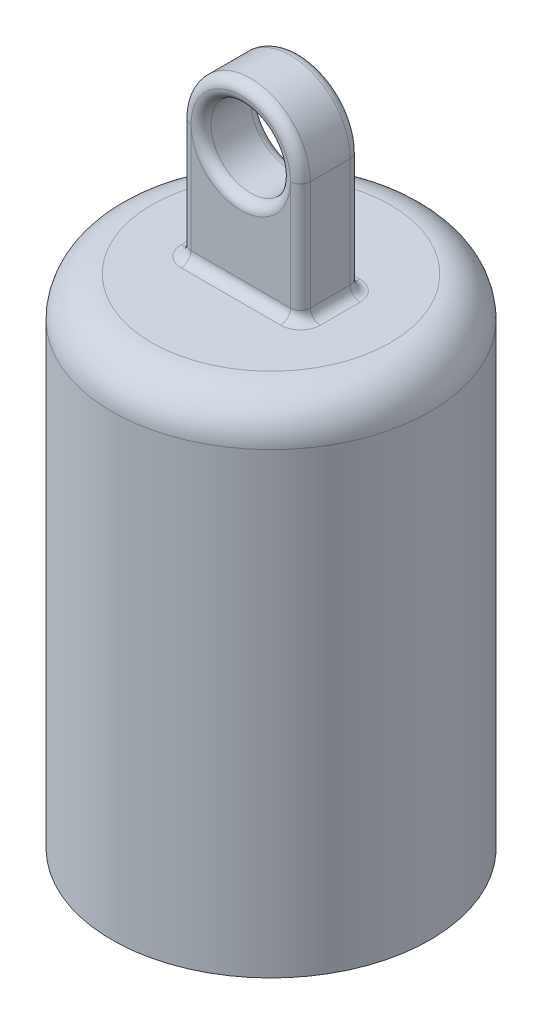
ISO-10303-21;
HEADER;
FILE_DESCRIPTION(('STEP AP214'),'2;1');
FILE_NAME('part.step','',(''),(''),'','','');
FILE_SCHEMA(('AUTOMOTIVE_DESIGN { 1 0 10303 214 1 1 1 1 }'));
ENDSEC;
DATA;
#1=APPLICATION_CONTEXT('core data for automotive mechanical design processes');
#2=APPLICATION_PROTOCOL_DEFINITION('international standard','automotive_design',2000,#1);
#3=PRODUCT_CONTEXT('',#1,'mechanical');
#4=PRODUCT('Part','Part','',(#3));
#5=PRODUCT_RELATED_PRODUCT_CATEGORY('part','',(#4));
#6=PRODUCT_DEFINITION_FORMATION('','',#4);
#7=PRODUCT_DEFINITION_CONTEXT('part definition',#1,'design');
#8=PRODUCT_DEFINITION('design','',#6,#7);
#9=PRODUCT_DEFINITION_SHAPE('','',#8);
#10=(LENGTH_UNIT() NAMED_UNIT(*) SI_UNIT(.MILLI.,.METRE.));
#11=(NAMED_UNIT(*) PLANE_ANGLE_UNIT() SI_UNIT($,.RADIAN.));
#12=(NAMED_UNIT(*) SI_UNIT($,.STERADIAN.) SOLID_ANGLE_UNIT());
#13=UNCERTAINTY_MEASURE_WITH_UNIT(LENGTH_MEASURE(1.E-05),#10,'distance_accuracy_value','');
#14=(GEOMETRIC_REPRESENTATION_CONTEXT(3) GLOBAL_UNCERTAINTY_ASSIGNED_CONTEXT((#13)) GLOBAL_UNIT_ASSIGNED_CONTEXT((#10,
#11,#12)) REPRESENTATION_CONTEXT('',''));
#15=CARTESIAN_POINT('',(0.,0.,0.));
#16=DIRECTION('',(0.,0.,1.));
#17=DIRECTION('',(1.,0.,0.));
#18=AXIS2_PLACEMENT_3D('',#15,#16,#17);
#19=CARTESIAN_POINT('',(3.02284910218731,0.,0.));
#20=DIRECTION('',(0.,-1.,0.));
#21=DIRECTION('',(0.,0.,-1.));
#22=AXIS2_PLACEMENT_3D('',#19,#20,#21);
#23=PLANE('',#22);
#24=CARTESIAN_POINT('',(3.02284910218731,0.,0.));
#25=DIRECTION('',(0.,-1.,0.));
#26=DIRECTION('',(0.,0.,-1.));
#27=AXIS2_PLACEMENT_3D('',#24,#25,#26);
#28=CIRCLE('',#27,6.);
#29=CARTESIAN_POINT('',(3.02284910218731,0.,-6.));
#30=VERTEX_POINT('',#29);
#31=EDGE_CURVE('E11',#30,#30,#28,.F.);
#32=ORIENTED_EDGE('',*,*,#31,.T.);
#33=EDGE_LOOP('',(#32));
#34=FACE_BOUND('',#33,.T.);
#35=CARTESIAN_POINT('',(5.5,0.,1.));
#36=DIRECTION('',(0.,-1.,0.));
#37=DIRECTION('',(0.,0.,-1.));
#38=AXIS2_PLACEMENT_3D('',#35,#36,#37);
#39=CIRCLE('',#38,1.);
#40=CARTESIAN_POINT('',(5.5,0.,2.));
#41=VERTEX_POINT('',#40);
#42=CARTESIAN_POINT('',(6.5,0.,1.));
#43=VERTEX_POINT('',#42);
#44=EDGE_CURVE('E219',#41,#43,#39,.F.);
#45=ORIENTED_EDGE('',*,*,#44,.F.);
#46=DIRECTION('',(1.,0.,0.));
#47=VECTOR('',#46,1.);
#48=CARTESIAN_POINT('',(3.02284910218731,0.,2.));
#49=LINE('',#48,#47);
#50=CARTESIAN_POINT('',(0.5,0.,2.));
#51=VERTEX_POINT('',#50);
#52=EDGE_CURVE('E223',#41,#51,#49,.F.);
#53=ORIENTED_EDGE('',*,*,#52,.T.);
#54=CARTESIAN_POINT('',(0.5,0.,1.));
#55=DIRECTION('',(0.,-1.,0.));
#56=DIRECTION('',(0.,0.,-1.));
#57=AXIS2_PLACEMENT_3D('',#54,#55,#56);
#58=CIRCLE('',#57,1.);
#59=CARTESIAN_POINT('',(-0.5,0.,1.));
#60=VERTEX_POINT('',#59);
#61=EDGE_CURVE('E584',#60,#51,#58,.F.);
#62=ORIENTED_EDGE('',*,*,#61,.F.);
#63=DIRECTION('',(0.,0.,-1.));
#64=VECTOR('',#63,1.);
#65=CARTESIAN_POINT('',(-0.5,0.,-1.5));
#66=LINE('',#65,#64);
#67=CARTESIAN_POINT('',(-0.5,0.,-1.));
#68=VERTEX_POINT('',#67);
#69=EDGE_CURVE('E265',#60,#68,#66,.T.);
#70=ORIENTED_EDGE('',*,*,#69,.T.);
#71=CARTESIAN_POINT('',(0.5,0.,-1.));
#72=DIRECTION('',(0.,-1.,0.));
#73=DIRECTION('',(0.,0.,-1.));
#74=AXIS2_PLACEMENT_3D('',#71,#72,#73);
#75=CIRCLE('',#74,1.);
#76=CARTESIAN_POINT('',(0.5,0.,-2.));
#77=VERTEX_POINT('',#76);
#78=EDGE_CURVE('E147',#77,#68,#75,.F.);
#79=ORIENTED_EDGE('',*,*,#78,.F.);
#80=DIRECTION('',(1.,0.,0.));
#81=VECTOR('',#80,1.);
#82=CARTESIAN_POINT('',(6.,0.,-2.));
#83=LINE('',#82,#81);
#84=CARTESIAN_POINT('',(5.5,0.,-2.));
#85=VERTEX_POINT('',#84);
#86=EDGE_CURVE('E131',#77,#85,#83,.T.);
#87=ORIENTED_EDGE('',*,*,#86,.T.);
#88=CARTESIAN_POINT('',(5.5,0.,-1.));
#89=DIRECTION('',(0.,-1.,0.));
#90=DIRECTION('',(0.,0.,-1.));
#91=AXIS2_PLACEMENT_3D('',#88,#89,#90);
#92=CIRCLE('',#91,1.);
#93=CARTESIAN_POINT('',(6.5,0.,-1.));
#94=VERTEX_POINT('',#93);
#95=EDGE_CURVE('E126',#94,#85,#92,.F.);
#96=ORIENTED_EDGE('',*,*,#95,.F.);
#97=DIRECTION('',(0.,0.,-1.));
#98=VECTOR('',#97,1.);
#99=CARTESIAN_POINT('',(6.5,0.,1.5));
#100=LINE('',#99,#98);
#101=EDGE_CURVE('E128',#94,#43,#100,.F.);
#102=ORIENTED_EDGE('',*,*,#101,.T.);
#103=EDGE_LOOP('',(#45,#53,#62,#70,#79,#87,#96,#102));
#104=FACE_BOUND('',#103,.T.);
#105=ADVANCED_FACE('F35',(#34,#104),#23,.F.);
#106=CARTESIAN_POINT('',(3.,6.,1.5));
#107=DIRECTION('',(0.,0.,1.));
#108=DIRECTION('',(1.,0.,0.));
#109=AXIS2_PLACEMENT_3D('',#106,#107,#108);
#110=PLANE('',#109);
#111=DIRECTION('',(0.,1.,0.));
#112=VECTOR('',#111,1.);
#113=CARTESIAN_POINT('',(5.5,6.,1.5));
#114=LINE('',#113,#112);
#115=CARTESIAN_POINT('',(5.5,0.5,1.5));
#116=VERTEX_POINT('',#115);
#117=CARTESIAN_POINT('',(5.5,6.,1.5));
#118=VERTEX_POINT('',#117);
#119=EDGE_CURVE('E244',#116,#118,#114,.T.);
#120=ORIENTED_EDGE('',*,*,#119,.T.);
#121=CARTESIAN_POINT('',(3.,6.,1.5));
#122=DIRECTION('',(0.,0.,1.));
#123=DIRECTION('',(1.,0.,0.));
#124=AXIS2_PLACEMENT_3D('',#121,#122,#123);
#125=CIRCLE('',#124,2.5);
#126=CARTESIAN_POINT('',(0.5,6.,1.5));
#127=VERTEX_POINT('',#126);
#128=EDGE_CURVE('E246',#118,#127,#125,.F.);
#129=ORIENTED_EDGE('',*,*,#128,.T.);
#130=DIRECTION('',(0.,-1.,0.));
#131=VECTOR('',#130,1.);
#132=CARTESIAN_POINT('',(0.5,0.,1.5));
#133=LINE('',#132,#131);
#134=CARTESIAN_POINT('',(0.5,0.5,1.5));
#135=VERTEX_POINT('',#134);
#136=EDGE_CURVE('E240',#127,#135,#133,.T.);
#137=ORIENTED_EDGE('',*,*,#136,.T.);
#138=DIRECTION('',(1.,0.,0.));
#139=VECTOR('',#138,1.);
#140=CARTESIAN_POINT('',(3.,0.5,1.5));
#141=LINE('',#140,#139);
#142=EDGE_CURVE('E242',#135,#116,#141,.T.);
#143=ORIENTED_EDGE('',*,*,#142,.T.);
#144=EDGE_LOOP('',(#120,#129,#137,#143));
#145=FACE_BOUND('',#144,.T.);
#146=ADVANCED_FACE('F288',(#145),#110,.T.);
#147=CARTESIAN_POINT('',(3.,6.,-1.5));
#148=DIRECTION('',(0.,0.,1.));
#149=DIRECTION('',(1.,0.,0.));
#150=AXIS2_PLACEMENT_3D('',#147,#148,#149);
#151=PLANE('',#150);
#152=CARTESIAN_POINT('',(3.,6.,-1.5));
#153=DIRECTION('',(0.,0.,1.));
#154=DIRECTION('',(1.,0.,0.));
#155=AXIS2_PLACEMENT_3D('',#152,#153,#154);
#156=CIRCLE('',#155,2.5);
#157=CARTESIAN_POINT('',(0.5,6.,-1.5));
#158=VERTEX_POINT('',#157);
#159=CARTESIAN_POINT('',(5.5,6.,-1.5));
#160=VERTEX_POINT('',#159);
#161=EDGE_CURVE('E169',#158,#160,#156,.T.);
#162=ORIENTED_EDGE('',*,*,#161,.T.);
#163=DIRECTION('',(0.,1.,0.));
#164=VECTOR('',#163,1.);
#165=CARTESIAN_POINT('',(5.5,6.,-1.5));
#166=LINE('',#165,#164);
#167=CARTESIAN_POINT('',(5.5,0.5,-1.5));
#168=VERTEX_POINT('',#167);
#169=EDGE_CURVE('E58',#160,#168,#166,.F.);
#170=ORIENTED_EDGE('',*,*,#169,.T.);
#171=DIRECTION('',(1.,0.,0.));
#172=VECTOR('',#171,1.);
#173=CARTESIAN_POINT('',(0.,0.5,-1.5));
#174=LINE('',#173,#172);
#175=CARTESIAN_POINT('',(0.5,0.5,-1.5));
#176=VERTEX_POINT('',#175);
#177=EDGE_CURVE('E171',#168,#176,#174,.F.);
#178=ORIENTED_EDGE('',*,*,#177,.T.);
#179=DIRECTION('',(0.,-1.,0.));
#180=VECTOR('',#179,1.);
#181=CARTESIAN_POINT('',(0.5,6.,-1.5));
#182=LINE('',#181,#180);
#183=EDGE_CURVE('E211',#176,#158,#182,.F.);
#184=ORIENTED_EDGE('',*,*,#183,.T.);
#185=EDGE_LOOP('',(#162,#170,#178,#184));
#186=FACE_BOUND('',#185,.T.);
#187=ADVANCED_FACE('F254',(#186),#151,.F.);
#188=CARTESIAN_POINT('',(0.,0.,1.5));
#189=DIRECTION('',(1.,0.,0.));
#190=DIRECTION('',(0.,0.,-1.));
#191=AXIS2_PLACEMENT_3D('',#188,#189,#190);
#192=PLANE('',#191);
#193=DIRECTION('',(0.,0.,-1.));
#194=VECTOR('',#193,1.);
#195=CARTESIAN_POINT('',(0.,0.5,1.5));
#196=LINE('',#195,#194);
#197=CARTESIAN_POINT('',(0.,0.5,-1.));
#198=VERTEX_POINT('',#197);
#199=CARTESIAN_POINT('',(0.,0.5,1.));
#200=VERTEX_POINT('',#199);
#201=EDGE_CURVE('E218',#198,#200,#196,.F.);
#202=ORIENTED_EDGE('',*,*,#201,.T.);
#203=DIRECTION('',(0.,-1.,0.));
#204=VECTOR('',#203,1.);
#205=CARTESIAN_POINT('',(0.,6.,1.));
#206=LINE('',#205,#204);
#207=CARTESIAN_POINT('',(0.,6.,1.));
#208=VERTEX_POINT('',#207);
#209=EDGE_CURVE('E221',#200,#208,#206,.F.);
#210=ORIENTED_EDGE('',*,*,#209,.T.);
#211=DIRECTION('',(0.,0.,-1.));
#212=VECTOR('',#211,1.);
#213=CARTESIAN_POINT('',(0.,6.,1.5));
#214=LINE('',#213,#212);
#215=CARTESIAN_POINT('',(0.,6.,-1.));
#216=VERTEX_POINT('',#215);
#217=EDGE_CURVE('E270',#208,#216,#214,.T.);
#218=ORIENTED_EDGE('',*,*,#217,.T.);
#219=DIRECTION('',(0.,-1.,0.));
#220=VECTOR('',#219,1.);
#221=CARTESIAN_POINT('',(0.,0.,-1.));
#222=LINE('',#221,#220);
#223=EDGE_CURVE('E213',#216,#198,#222,.T.);
#224=ORIENTED_EDGE('',*,*,#223,.T.);
#225=EDGE_LOOP('',(#202,#210,#218,#224));
#226=FACE_BOUND('',#225,.T.);
#227=ADVANCED_FACE('F267',(#226),#192,.F.);
#228=CARTESIAN_POINT('',(6.,0.,1.5));
#229=DIRECTION('',(-1.,0.,0.));
#230=DIRECTION('',(0.,0.,1.));
#231=AXIS2_PLACEMENT_3D('',#228,#229,#230);
#232=PLANE('',#231);
#233=DIRECTION('',(0.,0.,-1.));
#234=VECTOR('',#233,1.);
#235=CARTESIAN_POINT('',(6.,6.,1.5));
#236=LINE('',#235,#234);
#237=CARTESIAN_POINT('',(6.,6.,1.));
#238=VERTEX_POINT('',#237);
#239=CARTESIAN_POINT('',(6.,6.,-1.));
#240=VERTEX_POINT('',#239);
#241=EDGE_CURVE('E136',#238,#240,#236,.T.);
#242=ORIENTED_EDGE('',*,*,#241,.F.);
#243=DIRECTION('',(0.,1.,0.));
#244=VECTOR('',#243,1.);
#245=CARTESIAN_POINT('',(6.,0.,1.));
#246=LINE('',#245,#244);
#247=CARTESIAN_POINT('',(6.,0.5,1.));
#248=VERTEX_POINT('',#247);
#249=EDGE_CURVE('E232',#238,#248,#246,.F.);
#250=ORIENTED_EDGE('',*,*,#249,.T.);
#251=DIRECTION('',(0.,0.,-1.));
#252=VECTOR('',#251,1.);
#253=CARTESIAN_POINT('',(6.,0.5,-1.5));
#254=LINE('',#253,#252);
#255=CARTESIAN_POINT('',(6.,0.5,-1.));
#256=VERTEX_POINT('',#255);
#257=EDGE_CURVE('E230',#248,#256,#254,.T.);
#258=ORIENTED_EDGE('',*,*,#257,.T.);
#259=DIRECTION('',(0.,1.,0.));
#260=VECTOR('',#259,1.);
#261=CARTESIAN_POINT('',(6.,0.,-1.));
#262=LINE('',#261,#260);
#263=EDGE_CURVE('E228',#256,#240,#262,.T.);
#264=ORIENTED_EDGE('',*,*,#263,.T.);
#265=EDGE_LOOP('',(#242,#250,#258,#264));
#266=FACE_BOUND('',#265,.T.);
#267=ADVANCED_FACE('F340',(#266),#232,.F.);
#268=CARTESIAN_POINT('',(3.,6.,1.5));
#269=DIRECTION('',(0.,0.,-1.));
#270=DIRECTION('',(-1.,0.,0.));
#271=AXIS2_PLACEMENT_3D('',#268,#269,#270);
#272=CYLINDRICAL_SURFACE('',#271,3.);
#273=ORIENTED_EDGE('',*,*,#217,.F.);
#274=CARTESIAN_POINT('',(3.,6.,1.));
#275=DIRECTION('',(0.,0.,1.));
#276=DIRECTION('',(1.,0.,0.));
#277=AXIS2_PLACEMENT_3D('',#274,#275,#276);
#278=CIRCLE('',#277,3.);
#279=EDGE_CURVE('E251',#208,#238,#278,.F.);
#280=ORIENTED_EDGE('',*,*,#279,.T.);
#281=ORIENTED_EDGE('',*,*,#241,.T.);
#282=CARTESIAN_POINT('',(3.,6.,-1.));
#283=DIRECTION('',(0.,0.,1.));
#284=DIRECTION('',(1.,0.,0.));
#285=AXIS2_PLACEMENT_3D('',#282,#283,#284);
#286=CIRCLE('',#285,3.);
#287=EDGE_CURVE('E249',#240,#216,#286,.T.);
#288=ORIENTED_EDGE('',*,*,#287,.T.);
#289=EDGE_LOOP('',(#273,#280,#281,#288));
#290=FACE_BOUND('',#289,.T.);
#291=ADVANCED_FACE('F275',(#290),#272,.T.);
#292=CARTESIAN_POINT('',(3.,6.,1.5));
#293=DIRECTION('',(0.,0.,-1.));
#294=DIRECTION('',(-1.,0.,0.));
#295=AXIS2_PLACEMENT_3D('',#292,#293,#294);
#296=CYLINDRICAL_SURFACE('',#295,2.);
#297=CARTESIAN_POINT('',(3.,6.,1.));
#298=DIRECTION('',(0.,0.,1.));
#299=DIRECTION('',(1.,0.,0.));
#300=AXIS2_PLACEMENT_3D('',#297,#298,#299);
#301=CIRCLE('',#300,2.);
#302=CARTESIAN_POINT('',(5.,6.,1.));
#303=VERTEX_POINT('',#302);
#304=EDGE_CURVE('E237',#303,#303,#301,.T.);
#305=ORIENTED_EDGE('',*,*,#304,.T.);
#306=EDGE_LOOP('',(#305));
#307=FACE_BOUND('',#306,.T.);
#308=CARTESIAN_POINT('',(3.,6.,-1.));
#309=DIRECTION('',(0.,0.,1.));
#310=DIRECTION('',(1.,0.,0.));
#311=AXIS2_PLACEMENT_3D('',#308,#309,#310);
#312=CIRCLE('',#311,2.);
#313=CARTESIAN_POINT('',(5.,6.,-1.));
#314=VERTEX_POINT('',#313);
#315=EDGE_CURVE('E234',#314,#314,#312,.F.);
#316=ORIENTED_EDGE('',*,*,#315,.T.);
#317=EDGE_LOOP('',(#316));
#318=FACE_BOUND('',#317,.T.);
#319=ADVANCED_FACE('F332',(#307,#318),#296,.F.);
#320=CARTESIAN_POINT('',(3.02284910218731,-25.,0.));
#321=DIRECTION('',(0.,1.,0.));
#322=DIRECTION('',(0.,0.,1.));
#323=AXIS2_PLACEMENT_3D('',#320,#321,#322);
#324=CYLINDRICAL_SURFACE('',#323,8.);
#325=CARTESIAN_POINT('',(3.02284910218731,-2.,0.));
#326=DIRECTION('',(0.,-1.,0.));
#327=DIRECTION('',(0.,0.,-1.));
#328=AXIS2_PLACEMENT_3D('',#325,#326,#327);
#329=CIRCLE('',#328,8.);
#330=CARTESIAN_POINT('',(3.02284910218731,-2.,-8.));
#331=VERTEX_POINT('',#330);
#332=EDGE_CURVE('E43',#331,#331,#329,.T.);
#333=ORIENTED_EDGE('',*,*,#332,.T.);
#334=EDGE_LOOP('',(#333));
#335=FACE_BOUND('',#334,.T.);
#336=CARTESIAN_POINT('',(3.02284910218731,-25.,0.));
#337=DIRECTION('',(0.,-1.,0.));
#338=DIRECTION('',(0.,0.,-1.));
#339=AXIS2_PLACEMENT_3D('',#336,#337,#338);
#340=CIRCLE('',#339,8.);
#341=CARTESIAN_POINT('',(3.02284910218731,-25.,-8.));
#342=VERTEX_POINT('',#341);
#343=EDGE_CURVE('E278',#342,#342,#340,.T.);
#344=ORIENTED_EDGE('',*,*,#343,.F.);
#345=EDGE_LOOP('',(#344));
#346=FACE_BOUND('',#345,.T.);
#347=ADVANCED_FACE('F329',(#335,#346),#324,.T.);
#348=CARTESIAN_POINT('',(3.02284910218731,-25.,0.));
#349=DIRECTION('',(0.,-1.,0.));
#350=DIRECTION('',(0.,0.,-1.));
#351=AXIS2_PLACEMENT_3D('',#348,#349,#350);
#352=PLANE('',#351);
#353=CARTESIAN_POINT('',(2.99484837586661,-25.,0.));
#354=DIRECTION('',(0.,-1.,0.));
#355=DIRECTION('',(0.,0.,-1.));
#356=AXIS2_PLACEMENT_3D('',#353,#354,#355);
#357=CIRCLE('',#356,1.5);
#358=CARTESIAN_POINT('',(2.99484837586661,-25.,-1.5));
#359=VERTEX_POINT('',#358);
#360=EDGE_CURVE('E571',#359,#359,#357,.T.);
#361=ORIENTED_EDGE('',*,*,#360,.F.);
#362=EDGE_LOOP('',(#361));
#363=FACE_BOUND('',#362,.T.);
#364=ORIENTED_EDGE('',*,*,#343,.T.);
#365=EDGE_LOOP('',(#364));
#366=FACE_BOUND('',#365,.T.);
#367=ADVANCED_FACE('F327',(#363,#366),#352,.T.);
#368=CARTESIAN_POINT('',(2.99484837586661,-23.,0.));
#369=DIRECTION('',(0.,-1.,0.));
#370=DIRECTION('',(0.,0.,-1.));
#371=AXIS2_PLACEMENT_3D('',#368,#369,#370);
#372=CYLINDRICAL_SURFACE('',#371,1.5);
#373=CARTESIAN_POINT('',(2.99484837586661,-23.,0.));
#374=DIRECTION('',(0.,-1.,0.));
#375=DIRECTION('',(0.,0.,-1.));
#376=AXIS2_PLACEMENT_3D('',#373,#374,#375);
#377=CIRCLE('',#376,1.5);
#378=CARTESIAN_POINT('',(2.99484837586661,-23.,-1.5));
#379=VERTEX_POINT('',#378);
#380=EDGE_CURVE('E576',#379,#379,#377,.F.);
#381=ORIENTED_EDGE('',*,*,#380,.T.);
#382=EDGE_LOOP('',(#381));
#383=FACE_BOUND('',#382,.T.);
#384=ORIENTED_EDGE('',*,*,#360,.T.);
#385=EDGE_LOOP('',(#384));
#386=FACE_BOUND('',#385,.T.);
#387=ADVANCED_FACE('F549',(#383,#386),#372,.F.);
#388=CARTESIAN_POINT('',(2.99484837586661,-23.,0.));
#389=DIRECTION('',(0.,-1.,0.));
#390=DIRECTION('',(0.,0.,-1.));
#391=AXIS2_PLACEMENT_3D('',#388,#389,#390);
#392=PLANE('',#391);
#393=CARTESIAN_POINT('',(2.99484837586661,-23.,0.));
#394=DIRECTION('',(0.,-1.,0.));
#395=DIRECTION('',(0.,0.,-1.));
#396=AXIS2_PLACEMENT_3D('',#393,#394,#395);
#397=CIRCLE('',#396,6.);
#398=CARTESIAN_POINT('',(2.99484837586661,-23.,-6.));
#399=VERTEX_POINT('',#398);
#400=EDGE_CURVE('E165',#399,#399,#397,.T.);
#401=ORIENTED_EDGE('',*,*,#400,.F.);
#402=EDGE_LOOP('',(#401));
#403=FACE_BOUND('',#402,.T.);
#404=ORIENTED_EDGE('',*,*,#380,.F.);
#405=EDGE_LOOP('',(#404));
#406=FACE_BOUND('',#405,.T.);
#407=ADVANCED_FACE('F539',(#403,#406),#392,.F.);
#408=CARTESIAN_POINT('',(2.99484837586661,-3.,0.));
#409=DIRECTION('',(0.,-1.,0.));
#410=DIRECTION('',(0.,0.,-1.));
#411=AXIS2_PLACEMENT_3D('',#408,#409,#410);
#412=CYLINDRICAL_SURFACE('',#411,6.);
#413=CARTESIAN_POINT('',(2.99484837586661,-3.,0.));
#414=DIRECTION('',(0.,-1.,0.));
#415=DIRECTION('',(0.,0.,-1.));
#416=AXIS2_PLACEMENT_3D('',#413,#414,#415);
#417=CIRCLE('',#416,6.);
#418=CARTESIAN_POINT('',(2.99484837586661,-3.,-6.));
#419=VERTEX_POINT('',#418);
#420=EDGE_CURVE('E588',#419,#419,#417,.T.);
#421=ORIENTED_EDGE('',*,*,#420,.F.);
#422=EDGE_LOOP('',(#421));
#423=FACE_BOUND('',#422,.T.);
#424=ORIENTED_EDGE('',*,*,#400,.T.);
#425=EDGE_LOOP('',(#424));
#426=FACE_BOUND('',#425,.T.);
#427=ADVANCED_FACE('F314',(#423,#426),#412,.F.);
#428=CARTESIAN_POINT('',(2.99484837586661,-3.,0.));
#429=DIRECTION('',(0.,-1.,0.));
#430=DIRECTION('',(0.,0.,-1.));
#431=AXIS2_PLACEMENT_3D('',#428,#429,#430);
#432=PLANE('',#431);
#433=ORIENTED_EDGE('',*,*,#420,.T.);
#434=EDGE_LOOP('',(#433));
#435=FACE_BOUND('',#434,.T.);
#436=ADVANCED_FACE('F306',(#435),#432,.T.);
#437=CARTESIAN_POINT('',(3.,6.,1.));
#438=DIRECTION('',(0.,0.,1.));
#439=DIRECTION('',(1.,0.,0.));
#440=AXIS2_PLACEMENT_3D('',#437,#438,#439);
#441=TOROIDAL_SURFACE('',#440,2.5,0.5);
#442=ORIENTED_EDGE('',*,*,#304,.F.);
#443=EDGE_LOOP('',(#442));
#444=FACE_BOUND('',#443,.T.);
#445=CARTESIAN_POINT('',(3.,6.,1.5));
#446=DIRECTION('',(0.,0.,1.));
#447=DIRECTION('',(1.,0.,0.));
#448=AXIS2_PLACEMENT_3D('',#445,#446,#447);
#449=CIRCLE('',#448,2.5);
#450=EDGE_CURVE('E160',#127,#118,#449,.F.);
#451=ORIENTED_EDGE('',*,*,#450,.F.);
#452=ORIENTED_EDGE('',*,*,#128,.F.);
#453=EDGE_LOOP('',(#451,#452));
#454=FACE_BOUND('',#453,.T.);
#455=ADVANCED_FACE('F304',(#444,#454),#441,.T.);
#456=CARTESIAN_POINT('',(5.5,6.,1.));
#457=DIRECTION('',(0.,-1.,0.));
#458=DIRECTION('',(0.,0.,-1.));
#459=AXIS2_PLACEMENT_3D('',#456,#457,#458);
#460=CYLINDRICAL_SURFACE('',#459,0.5);
#461=CARTESIAN_POINT('',(5.5,0.5,1.));
#462=DIRECTION('',(0.,-1.,0.));
#463=DIRECTION('',(0.,0.,-1.));
#464=AXIS2_PLACEMENT_3D('',#461,#462,#463);
#465=CIRCLE('',#464,0.5);
#466=EDGE_CURVE('E152',#248,#116,#465,.T.);
#467=ORIENTED_EDGE('',*,*,#466,.F.);
#468=ORIENTED_EDGE('',*,*,#249,.F.);
#469=CARTESIAN_POINT('',(5.5,6.,1.));
#470=DIRECTION('',(0.,1.,0.));
#471=DIRECTION('',(0.,0.,1.));
#472=AXIS2_PLACEMENT_3D('',#469,#470,#471);
#473=CIRCLE('',#472,0.5);
#474=EDGE_CURVE('E163',#118,#238,#473,.T.);
#475=ORIENTED_EDGE('',*,*,#474,.F.);
#476=ORIENTED_EDGE('',*,*,#119,.F.);
#477=EDGE_LOOP('',(#467,#468,#475,#476));
#478=FACE_BOUND('',#477,.T.);
#479=ADVANCED_FACE('F302',(#478),#460,.T.);
#480=CARTESIAN_POINT('',(3.,6.,-1.));
#481=DIRECTION('',(0.,0.,1.));
#482=DIRECTION('',(1.,0.,0.));
#483=AXIS2_PLACEMENT_3D('',#480,#481,#482);
#484=TOROIDAL_SURFACE('',#483,2.5,0.5);
#485=ORIENTED_EDGE('',*,*,#315,.F.);
#486=EDGE_LOOP('',(#485));
#487=FACE_BOUND('',#486,.T.);
#488=CARTESIAN_POINT('',(3.,6.,-1.5));
#489=DIRECTION('',(0.,0.,1.));
#490=DIRECTION('',(1.,0.,0.));
#491=AXIS2_PLACEMENT_3D('',#488,#489,#490);
#492=CIRCLE('',#491,2.5);
#493=EDGE_CURVE('E154',#160,#158,#492,.T.);
#494=ORIENTED_EDGE('',*,*,#493,.F.);
#495=ORIENTED_EDGE('',*,*,#161,.F.);
#496=EDGE_LOOP('',(#494,#495));
#497=FACE_BOUND('',#496,.T.);
#498=ADVANCED_FACE('F312',(#487,#497),#484,.T.);
#499=CARTESIAN_POINT('',(6.5,0.5,1.5));
#500=DIRECTION('',(0.,0.,1.));
#501=DIRECTION('',(1.,0.,0.));
#502=AXIS2_PLACEMENT_3D('',#499,#500,#501);
#503=CYLINDRICAL_SURFACE('',#502,0.5);
#504=CARTESIAN_POINT('',(6.5,0.5,-1.));
#505=DIRECTION('',(0.,0.,1.));
#506=DIRECTION('',(1.,0.,0.));
#507=AXIS2_PLACEMENT_3D('',#504,#505,#506);
#508=CIRCLE('',#507,0.5);
#509=EDGE_CURVE('E142',#256,#94,#508,.T.);
#510=ORIENTED_EDGE('',*,*,#509,.F.);
#511=ORIENTED_EDGE('',*,*,#257,.F.);
#512=CARTESIAN_POINT('',(6.5,0.5,1.));
#513=DIRECTION('',(0.,0.,-1.));
#514=DIRECTION('',(-1.,0.,0.));
#515=AXIS2_PLACEMENT_3D('',#512,#513,#514);
#516=CIRCLE('',#515,0.5);
#517=EDGE_CURVE('E145',#43,#248,#516,.T.);
#518=ORIENTED_EDGE('',*,*,#517,.F.);
#519=ORIENTED_EDGE('',*,*,#101,.F.);
#520=EDGE_LOOP('',(#510,#511,#518,#519));
#521=FACE_BOUND('',#520,.T.);
#522=ADVANCED_FACE('F140',(#521),#503,.F.);
#523=CARTESIAN_POINT('',(5.5,0.,-1.));
#524=DIRECTION('',(0.,1.,0.));
#525=DIRECTION('',(0.,0.,1.));
#526=AXIS2_PLACEMENT_3D('',#523,#524,#525);
#527=CYLINDRICAL_SURFACE('',#526,0.5);
#528=CARTESIAN_POINT('',(5.5,6.,-1.));
#529=DIRECTION('',(0.,1.,0.));
#530=DIRECTION('',(0.,0.,1.));
#531=AXIS2_PLACEMENT_3D('',#528,#529,#530);
#532=CIRCLE('',#531,0.5);
#533=EDGE_CURVE('E50',#240,#160,#532,.T.);
#534=ORIENTED_EDGE('',*,*,#533,.F.);
#535=ORIENTED_EDGE('',*,*,#263,.F.);
#536=CARTESIAN_POINT('',(5.5,0.5,-1.));
#537=DIRECTION('',(0.,-1.,0.));
#538=DIRECTION('',(0.,0.,-1.));
#539=AXIS2_PLACEMENT_3D('',#536,#537,#538);
#540=CIRCLE('',#539,0.5);
#541=EDGE_CURVE('E150',#168,#256,#540,.T.);
#542=ORIENTED_EDGE('',*,*,#541,.F.);
#543=ORIENTED_EDGE('',*,*,#169,.F.);
#544=EDGE_LOOP('',(#534,#535,#542,#543));
#545=FACE_BOUND('',#544,.T.);
#546=ADVANCED_FACE('F370',(#545),#527,.T.);
#547=CARTESIAN_POINT('',(3.,6.,1.));
#548=DIRECTION('',(0.,0.,1.));
#549=DIRECTION('',(1.,0.,0.));
#550=AXIS2_PLACEMENT_3D('',#547,#548,#549);
#551=TOROIDAL_SURFACE('',#550,2.5,0.5);
#552=ORIENTED_EDGE('',*,*,#474,.T.);
#553=ORIENTED_EDGE('',*,*,#279,.F.);
#554=CARTESIAN_POINT('',(0.5,6.,1.));
#555=DIRECTION('',(0.,-1.,0.));
#556=DIRECTION('',(0.,0.,-1.));
#557=AXIS2_PLACEMENT_3D('',#554,#555,#556);
#558=CIRCLE('',#557,0.5);
#559=EDGE_CURVE('E199',#127,#208,#558,.T.);
#560=ORIENTED_EDGE('',*,*,#559,.F.);
#561=ORIENTED_EDGE('',*,*,#450,.T.);
#562=EDGE_LOOP('',(#552,#553,#560,#561));
#563=FACE_BOUND('',#562,.T.);
#564=ADVANCED_FACE('F282',(#563),#551,.T.);
#565=CARTESIAN_POINT('',(5.5,0.5,1.));
#566=DIRECTION('',(0.,-1.,0.));
#567=DIRECTION('',(0.,0.,-1.));
#568=AXIS2_PLACEMENT_3D('',#565,#566,#567);
#569=TOROIDAL_SURFACE('',#568,1.,0.5);
#570=ORIENTED_EDGE('',*,*,#517,.T.);
#571=ORIENTED_EDGE('',*,*,#466,.T.);
#572=CARTESIAN_POINT('',(5.5,0.5,2.));
#573=DIRECTION('',(-1.,0.,0.));
#574=DIRECTION('',(0.,0.,1.));
#575=AXIS2_PLACEMENT_3D('',#572,#573,#574);
#576=CIRCLE('',#575,0.5);
#577=EDGE_CURVE('E196',#41,#116,#576,.F.);
#578=ORIENTED_EDGE('',*,*,#577,.F.);
#579=ORIENTED_EDGE('',*,*,#44,.T.);
#580=EDGE_LOOP('',(#570,#571,#578,#579));
#581=FACE_BOUND('',#580,.T.);
#582=ADVANCED_FACE('F298',(#581),#569,.F.);
#583=CARTESIAN_POINT('',(5.5,0.5,-1.));
#584=DIRECTION('',(0.,-1.,0.));
#585=DIRECTION('',(0.,0.,-1.));
#586=AXIS2_PLACEMENT_3D('',#583,#584,#585);
#587=TOROIDAL_SURFACE('',#586,1.,0.5);
#588=ORIENTED_EDGE('',*,*,#509,.T.);
#589=ORIENTED_EDGE('',*,*,#95,.T.);
#590=CARTESIAN_POINT('',(5.5,0.5,-2.));
#591=DIRECTION('',(-1.,0.,0.));
#592=DIRECTION('',(0.,0.,1.));
#593=AXIS2_PLACEMENT_3D('',#590,#591,#592);
#594=CIRCLE('',#593,0.5);
#595=EDGE_CURVE('E194',#168,#85,#594,.F.);
#596=ORIENTED_EDGE('',*,*,#595,.F.);
#597=ORIENTED_EDGE('',*,*,#541,.T.);
#598=EDGE_LOOP('',(#588,#589,#596,#597));
#599=FACE_BOUND('',#598,.T.);
#600=ADVANCED_FACE('F149',(#599),#587,.F.);
#601=CARTESIAN_POINT('',(3.,6.,-1.));
#602=DIRECTION('',(0.,0.,1.));
#603=DIRECTION('',(1.,0.,0.));
#604=AXIS2_PLACEMENT_3D('',#601,#602,#603);
#605=TOROIDAL_SURFACE('',#604,2.5,0.5);
#606=ORIENTED_EDGE('',*,*,#533,.T.);
#607=ORIENTED_EDGE('',*,*,#493,.T.);
#608=CARTESIAN_POINT('',(0.5,6.,-1.));
#609=DIRECTION('',(0.,-1.,0.));
#610=DIRECTION('',(0.,0.,-1.));
#611=AXIS2_PLACEMENT_3D('',#608,#609,#610);
#612=CIRCLE('',#611,0.5);
#613=EDGE_CURVE('E191',#216,#158,#612,.T.);
#614=ORIENTED_EDGE('',*,*,#613,.F.);
#615=ORIENTED_EDGE('',*,*,#287,.F.);
#616=EDGE_LOOP('',(#606,#607,#614,#615));
#617=FACE_BOUND('',#616,.T.);
#618=ADVANCED_FACE('F203',(#617),#605,.T.);
#619=CARTESIAN_POINT('',(0.5,6.,1.));
#620=DIRECTION('',(0.,1.,0.));
#621=DIRECTION('',(0.,0.,1.));
#622=AXIS2_PLACEMENT_3D('',#619,#620,#621);
#623=CYLINDRICAL_SURFACE('',#622,0.5);
#624=ORIENTED_EDGE('',*,*,#559,.T.);
#625=ORIENTED_EDGE('',*,*,#209,.F.);
#626=CARTESIAN_POINT('',(0.5,0.5,1.));
#627=DIRECTION('',(0.,-1.,0.));
#628=DIRECTION('',(0.,0.,-1.));
#629=AXIS2_PLACEMENT_3D('',#626,#627,#628);
#630=CIRCLE('',#629,0.5);
#631=EDGE_CURVE('E188',#135,#200,#630,.T.);
#632=ORIENTED_EDGE('',*,*,#631,.F.);
#633=ORIENTED_EDGE('',*,*,#136,.F.);
#634=EDGE_LOOP('',(#624,#625,#632,#633));
#635=FACE_BOUND('',#634,.T.);
#636=ADVANCED_FACE('F285',(#635),#623,.T.);
#637=CARTESIAN_POINT('',(3.,0.5,2.));
#638=DIRECTION('',(1.,0.,0.));
#639=DIRECTION('',(0.,0.,-1.));
#640=AXIS2_PLACEMENT_3D('',#637,#638,#639);
#641=CYLINDRICAL_SURFACE('',#640,0.5);
#642=ORIENTED_EDGE('',*,*,#577,.T.);
#643=ORIENTED_EDGE('',*,*,#142,.F.);
#644=CARTESIAN_POINT('',(0.5,0.5,2.));
#645=DIRECTION('',(1.,0.,0.));
#646=DIRECTION('',(0.,0.,-1.));
#647=AXIS2_PLACEMENT_3D('',#644,#645,#646);
#648=CIRCLE('',#647,0.5);
#649=EDGE_CURVE('E185',#51,#135,#648,.T.);
#650=ORIENTED_EDGE('',*,*,#649,.F.);
#651=ORIENTED_EDGE('',*,*,#52,.F.);
#652=EDGE_LOOP('',(#642,#643,#650,#651));
#653=FACE_BOUND('',#652,.T.);
#654=ADVANCED_FACE('F293',(#653),#641,.F.);
#655=CARTESIAN_POINT('',(3.02284910218731,0.5,-2.));
#656=DIRECTION('',(-1.,0.,0.));
#657=DIRECTION('',(0.,0.,1.));
#658=AXIS2_PLACEMENT_3D('',#655,#656,#657);
#659=CYLINDRICAL_SURFACE('',#658,0.5);
#660=ORIENTED_EDGE('',*,*,#595,.T.);
#661=ORIENTED_EDGE('',*,*,#86,.F.);
#662=CARTESIAN_POINT('',(0.5,0.5,-2.));
#663=DIRECTION('',(1.,0.,0.));
#664=DIRECTION('',(0.,0.,-1.));
#665=AXIS2_PLACEMENT_3D('',#662,#663,#664);
#666=CIRCLE('',#665,0.5);
#667=EDGE_CURVE('E182',#176,#77,#666,.T.);
#668=ORIENTED_EDGE('',*,*,#667,.F.);
#669=ORIENTED_EDGE('',*,*,#177,.F.);
#670=EDGE_LOOP('',(#660,#661,#668,#669));
#671=FACE_BOUND('',#670,.T.);
#672=ADVANCED_FACE('F256',(#671),#659,.F.);
#673=CARTESIAN_POINT('',(0.5,0.,-1.));
#674=DIRECTION('',(0.,-1.,0.));
#675=DIRECTION('',(0.,0.,-1.));
#676=AXIS2_PLACEMENT_3D('',#673,#674,#675);
#677=CYLINDRICAL_SURFACE('',#676,0.5);
#678=ORIENTED_EDGE('',*,*,#613,.T.);
#679=ORIENTED_EDGE('',*,*,#183,.F.);
#680=CARTESIAN_POINT('',(0.5,0.5,-1.));
#681=DIRECTION('',(0.,-1.,0.));
#682=DIRECTION('',(0.,0.,-1.));
#683=AXIS2_PLACEMENT_3D('',#680,#681,#682);
#684=CIRCLE('',#683,0.5);
#685=EDGE_CURVE('E179',#198,#176,#684,.T.);
#686=ORIENTED_EDGE('',*,*,#685,.F.);
#687=ORIENTED_EDGE('',*,*,#223,.F.);
#688=EDGE_LOOP('',(#678,#679,#686,#687));
#689=FACE_BOUND('',#688,.T.);
#690=ADVANCED_FACE('F209',(#689),#677,.T.);
#691=CARTESIAN_POINT('',(0.5,0.5,1.));
#692=DIRECTION('',(0.,-1.,0.));
#693=DIRECTION('',(0.,0.,-1.));
#694=AXIS2_PLACEMENT_3D('',#691,#692,#693);
#695=TOROIDAL_SURFACE('',#694,1.,0.5);
#696=ORIENTED_EDGE('',*,*,#649,.T.);
#697=ORIENTED_EDGE('',*,*,#631,.T.);
#698=CARTESIAN_POINT('',(-0.5,0.5,1.));
#699=DIRECTION('',(0.,0.,-1.));
#700=DIRECTION('',(-1.,0.,0.));
#701=AXIS2_PLACEMENT_3D('',#698,#699,#700);
#702=CIRCLE('',#701,0.5);
#703=EDGE_CURVE('E177',#60,#200,#702,.F.);
#704=ORIENTED_EDGE('',*,*,#703,.F.);
#705=ORIENTED_EDGE('',*,*,#61,.T.);
#706=EDGE_LOOP('',(#696,#697,#704,#705));
#707=FACE_BOUND('',#706,.T.);
#708=ADVANCED_FACE('F350',(#707),#695,.F.);
#709=CARTESIAN_POINT('',(0.5,0.5,-1.));
#710=DIRECTION('',(0.,-1.,0.));
#711=DIRECTION('',(0.,0.,-1.));
#712=AXIS2_PLACEMENT_3D('',#709,#710,#711);
#713=TOROIDAL_SURFACE('',#712,1.,0.5);
#714=ORIENTED_EDGE('',*,*,#667,.T.);
#715=ORIENTED_EDGE('',*,*,#78,.T.);
#716=CARTESIAN_POINT('',(-0.5,0.5,-1.));
#717=DIRECTION('',(0.,0.,1.));
#718=DIRECTION('',(1.,0.,0.));
#719=AXIS2_PLACEMENT_3D('',#716,#717,#718);
#720=CIRCLE('',#719,0.5);
#721=EDGE_CURVE('E175',#198,#68,#720,.F.);
#722=ORIENTED_EDGE('',*,*,#721,.F.);
#723=ORIENTED_EDGE('',*,*,#685,.T.);
#724=EDGE_LOOP('',(#714,#715,#722,#723));
#725=FACE_BOUND('',#724,.T.);
#726=ADVANCED_FACE('F260',(#725),#713,.F.);
#727=CARTESIAN_POINT('',(-0.5,0.5,0.));
#728=DIRECTION('',(0.,0.,1.));
#729=DIRECTION('',(1.,0.,0.));
#730=AXIS2_PLACEMENT_3D('',#727,#728,#729);
#731=CYLINDRICAL_SURFACE('',#730,0.5);
#732=ORIENTED_EDGE('',*,*,#703,.T.);
#733=ORIENTED_EDGE('',*,*,#201,.F.);
#734=ORIENTED_EDGE('',*,*,#721,.T.);
#735=ORIENTED_EDGE('',*,*,#69,.F.);
#736=EDGE_LOOP('',(#732,#733,#734,#735));
#737=FACE_BOUND('',#736,.T.);
#738=ADVANCED_FACE('F264',(#737),#731,.F.);
#739=CARTESIAN_POINT('',(3.02284910218731,-2.,0.));
#740=DIRECTION('',(0.,-1.,0.));
#741=DIRECTION('',(0.,0.,-1.));
#742=AXIS2_PLACEMENT_3D('',#739,#740,#741);
#743=TOROIDAL_SURFACE('',#742,6.,2.);
#744=ORIENTED_EDGE('',*,*,#31,.F.);
#745=EDGE_LOOP('',(#744));
#746=FACE_BOUND('',#745,.T.);
#747=ORIENTED_EDGE('',*,*,#332,.F.);
#748=EDGE_LOOP('',(#747));
#749=FACE_BOUND('',#748,.T.);
#750=ADVANCED_FACE('F37',(#746,#749),#743,.T.);
#751=CLOSED_SHELL('',(#105,#146,#187,#227,#267,#291,#319,#347,#367,#387,#407,#427,#436,#455,
#479,#498,#522,#546,#564,#582,#600,#618,#636,#654,#672,#690,#708,#726,#738,#750));
#752=MANIFOLD_SOLID_BREP('B2',#751);
#753=ADVANCED_BREP_SHAPE_REPRESENTATION('',(#18,#752),#14);
#754=SHAPE_DEFINITION_REPRESENTATION(#9,#753);
ENDSEC;
END-ISO-10303-21;
